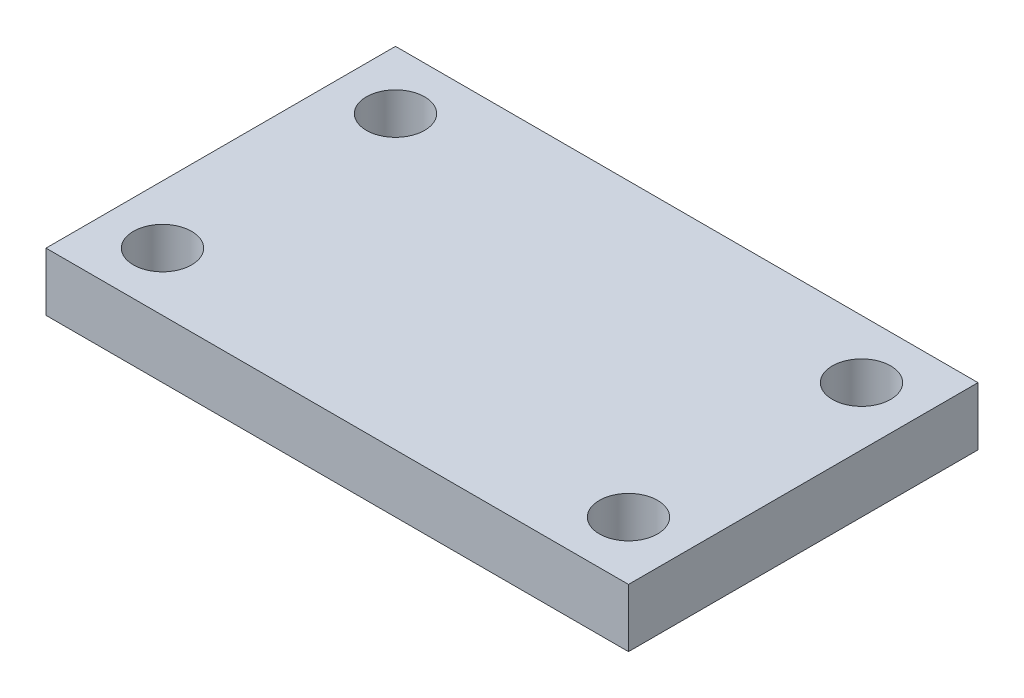
ISO-10303-21;
HEADER;
FILE_DESCRIPTION(('STEP AP214'),'2;1');
FILE_NAME('part.step','',(''),(''),'','','');
FILE_SCHEMA(('AUTOMOTIVE_DESIGN { 1 0 10303 214 1 1 1 1 }'));
ENDSEC;
DATA;
#1=APPLICATION_CONTEXT('core data for automotive mechanical design processes');
#2=APPLICATION_PROTOCOL_DEFINITION('international standard','automotive_design',2000,#1);
#3=PRODUCT_CONTEXT('',#1,'mechanical');
#4=PRODUCT('Part','Part','',(#3));
#5=PRODUCT_RELATED_PRODUCT_CATEGORY('part','',(#4));
#6=PRODUCT_DEFINITION_FORMATION('','',#4);
#7=PRODUCT_DEFINITION_CONTEXT('part definition',#1,'design');
#8=PRODUCT_DEFINITION('design','',#6,#7);
#9=PRODUCT_DEFINITION_SHAPE('','',#8);
#10=(LENGTH_UNIT() NAMED_UNIT(*) SI_UNIT(.MILLI.,.METRE.));
#11=(NAMED_UNIT(*) PLANE_ANGLE_UNIT() SI_UNIT($,.RADIAN.));
#12=(NAMED_UNIT(*) SI_UNIT($,.STERADIAN.) SOLID_ANGLE_UNIT());
#13=UNCERTAINTY_MEASURE_WITH_UNIT(LENGTH_MEASURE(1.E-05),#10,'distance_accuracy_value','');
#14=(GEOMETRIC_REPRESENTATION_CONTEXT(3) GLOBAL_UNCERTAINTY_ASSIGNED_CONTEXT((#13)) GLOBAL_UNIT_ASSIGNED_CONTEXT((#10,
#11,#12)) REPRESENTATION_CONTEXT('',''));
#15=CARTESIAN_POINT('',(0.,0.,0.));
#16=DIRECTION('',(0.,0.,1.));
#17=DIRECTION('',(1.,0.,0.));
#18=AXIS2_PLACEMENT_3D('',#15,#16,#17);
#19=CARTESIAN_POINT('',(0.,25.4,0.));
#20=DIRECTION('',(0.,1.,0.));
#21=DIRECTION('',(0.,0.,1.));
#22=AXIS2_PLACEMENT_3D('',#19,#20,#21);
#23=PLANE('',#22);
#24=CARTESIAN_POINT('',(-101.6,25.4,50.8));
#25=DIRECTION('',(0.,1.,0.));
#26=DIRECTION('',(0.,0.,1.));
#27=AXIS2_PLACEMENT_3D('',#24,#25,#26);
#28=CIRCLE('',#27,12.7);
#29=CARTESIAN_POINT('',(-101.6,25.4,63.5));
#30=VERTEX_POINT('',#29);
#31=EDGE_CURVE('E122',#30,#30,#28,.T.);
#32=ORIENTED_EDGE('',*,*,#31,.F.);
#33=EDGE_LOOP('',(#32));
#34=FACE_BOUND('',#33,.T.);
#35=CARTESIAN_POINT('',(-101.6,25.4,-50.8));
#36=DIRECTION('',(0.,1.,0.));
#37=DIRECTION('',(0.,0.,1.));
#38=AXIS2_PLACEMENT_3D('',#35,#36,#37);
#39=CIRCLE('',#38,12.7);
#40=CARTESIAN_POINT('',(-101.6,25.4,-38.1));
#41=VERTEX_POINT('',#40);
#42=EDGE_CURVE('E101',#41,#41,#39,.T.);
#43=ORIENTED_EDGE('',*,*,#42,.F.);
#44=EDGE_LOOP('',(#43));
#45=FACE_BOUND('',#44,.T.);
#46=DIRECTION('',(0.,0.,1.));
#47=VECTOR('',#46,1.);
#48=CARTESIAN_POINT('',(-127.,25.4,-76.2));
#49=LINE('',#48,#47);
#50=CARTESIAN_POINT('',(-127.,25.4,-76.2));
#51=VERTEX_POINT('',#50);
#52=CARTESIAN_POINT('',(-127.,25.4,76.2));
#53=VERTEX_POINT('',#52);
#54=EDGE_CURVE('E86',#51,#53,#49,.T.);
#55=ORIENTED_EDGE('',*,*,#54,.T.);
#56=DIRECTION('',(1.,0.,0.));
#57=VECTOR('',#56,1.);
#58=CARTESIAN_POINT('',(-127.,25.4,76.2));
#59=LINE('',#58,#57);
#60=CARTESIAN_POINT('',(127.,25.4,76.2));
#61=VERTEX_POINT('',#60);
#62=EDGE_CURVE('E81',#53,#61,#59,.T.);
#63=ORIENTED_EDGE('',*,*,#62,.T.);
#64=DIRECTION('',(0.,0.,-1.));
#65=VECTOR('',#64,1.);
#66=CARTESIAN_POINT('',(127.,25.4,-76.2));
#67=LINE('',#66,#65);
#68=CARTESIAN_POINT('',(127.,25.4,-76.2));
#69=VERTEX_POINT('',#68);
#70=EDGE_CURVE('E84',#61,#69,#67,.T.);
#71=ORIENTED_EDGE('',*,*,#70,.T.);
#72=DIRECTION('',(-1.,0.,0.));
#73=VECTOR('',#72,1.);
#74=CARTESIAN_POINT('',(-127.,25.4,-76.2));
#75=LINE('',#74,#73);
#76=EDGE_CURVE('E51',#69,#51,#75,.T.);
#77=ORIENTED_EDGE('',*,*,#76,.T.);
#78=EDGE_LOOP('',(#55,#63,#71,#77));
#79=FACE_BOUND('',#78,.T.);
#80=CARTESIAN_POINT('',(101.6,25.4,-50.8));
#81=DIRECTION('',(0.,1.,0.));
#82=DIRECTION('',(0.,0.,1.));
#83=AXIS2_PLACEMENT_3D('',#80,#81,#82);
#84=CIRCLE('',#83,12.7);
#85=CARTESIAN_POINT('',(101.6,25.4,-38.1));
#86=VERTEX_POINT('',#85);
#87=EDGE_CURVE('E116',#86,#86,#84,.T.);
#88=ORIENTED_EDGE('',*,*,#87,.F.);
#89=EDGE_LOOP('',(#88));
#90=FACE_BOUND('',#89,.T.);
#91=CARTESIAN_POINT('',(101.6,25.4,50.8));
#92=DIRECTION('',(0.,1.,0.));
#93=DIRECTION('',(0.,0.,1.));
#94=AXIS2_PLACEMENT_3D('',#91,#92,#93);
#95=CIRCLE('',#94,12.7);
#96=CARTESIAN_POINT('',(101.6,25.4,63.5));
#97=VERTEX_POINT('',#96);
#98=EDGE_CURVE('E128',#97,#97,#95,.T.);
#99=ORIENTED_EDGE('',*,*,#98,.F.);
#100=EDGE_LOOP('',(#99));
#101=FACE_BOUND('',#100,.T.);
#102=ADVANCED_FACE('F34',(#34,#45,#79,#90,#101),#23,.T.);
#103=CARTESIAN_POINT('',(0.,0.,0.));
#104=DIRECTION('',(0.,1.,0.));
#105=DIRECTION('',(0.,0.,1.));
#106=AXIS2_PLACEMENT_3D('',#103,#104,#105);
#107=PLANE('',#106);
#108=DIRECTION('',(0.,0.,1.));
#109=VECTOR('',#108,1.);
#110=CARTESIAN_POINT('',(-127.,0.,-76.2));
#111=LINE('',#110,#109);
#112=CARTESIAN_POINT('',(-127.,0.,-76.2));
#113=VERTEX_POINT('',#112);
#114=CARTESIAN_POINT('',(-127.,0.,76.2));
#115=VERTEX_POINT('',#114);
#116=EDGE_CURVE('E98',#113,#115,#111,.T.);
#117=ORIENTED_EDGE('',*,*,#116,.F.);
#118=DIRECTION('',(-1.,0.,0.));
#119=VECTOR('',#118,1.);
#120=CARTESIAN_POINT('',(-127.,0.,-76.2));
#121=LINE('',#120,#119);
#122=CARTESIAN_POINT('',(127.,0.,-76.2));
#123=VERTEX_POINT('',#122);
#124=EDGE_CURVE('E74',#123,#113,#121,.T.);
#125=ORIENTED_EDGE('',*,*,#124,.F.);
#126=DIRECTION('',(0.,0.,-1.));
#127=VECTOR('',#126,1.);
#128=CARTESIAN_POINT('',(127.,0.,-76.2));
#129=LINE('',#128,#127);
#130=CARTESIAN_POINT('',(127.,0.,76.2));
#131=VERTEX_POINT('',#130);
#132=EDGE_CURVE('E68',#131,#123,#129,.T.);
#133=ORIENTED_EDGE('',*,*,#132,.F.);
#134=DIRECTION('',(1.,0.,0.));
#135=VECTOR('',#134,1.);
#136=CARTESIAN_POINT('',(-127.,0.,76.2));
#137=LINE('',#136,#135);
#138=EDGE_CURVE('E90',#115,#131,#137,.T.);
#139=ORIENTED_EDGE('',*,*,#138,.F.);
#140=EDGE_LOOP('',(#117,#125,#133,#139));
#141=FACE_BOUND('',#140,.T.);
#142=CARTESIAN_POINT('',(-101.6,0.,-50.8));
#143=DIRECTION('',(0.,1.,0.));
#144=DIRECTION('',(0.,0.,1.));
#145=AXIS2_PLACEMENT_3D('',#142,#143,#144);
#146=CIRCLE('',#145,12.7);
#147=CARTESIAN_POINT('',(-101.6,0.,-38.1));
#148=VERTEX_POINT('',#147);
#149=EDGE_CURVE('E113',#148,#148,#146,.T.);
#150=ORIENTED_EDGE('',*,*,#149,.T.);
#151=EDGE_LOOP('',(#150));
#152=FACE_BOUND('',#151,.T.);
#153=CARTESIAN_POINT('',(101.6,0.,-50.8));
#154=DIRECTION('',(0.,1.,0.));
#155=DIRECTION('',(0.,0.,1.));
#156=AXIS2_PLACEMENT_3D('',#153,#154,#155);
#157=CIRCLE('',#156,12.7);
#158=CARTESIAN_POINT('',(101.6,0.,-38.1));
#159=VERTEX_POINT('',#158);
#160=EDGE_CURVE('E119',#159,#159,#157,.T.);
#161=ORIENTED_EDGE('',*,*,#160,.T.);
#162=EDGE_LOOP('',(#161));
#163=FACE_BOUND('',#162,.T.);
#164=CARTESIAN_POINT('',(-101.6,0.,50.8));
#165=DIRECTION('',(0.,1.,0.));
#166=DIRECTION('',(0.,0.,1.));
#167=AXIS2_PLACEMENT_3D('',#164,#165,#166);
#168=CIRCLE('',#167,12.7);
#169=CARTESIAN_POINT('',(-101.6,0.,63.5));
#170=VERTEX_POINT('',#169);
#171=EDGE_CURVE('E125',#170,#170,#168,.T.);
#172=ORIENTED_EDGE('',*,*,#171,.T.);
#173=EDGE_LOOP('',(#172));
#174=FACE_BOUND('',#173,.T.);
#175=CARTESIAN_POINT('',(101.6,0.,50.8));
#176=DIRECTION('',(0.,1.,0.));
#177=DIRECTION('',(0.,0.,1.));
#178=AXIS2_PLACEMENT_3D('',#175,#176,#177);
#179=CIRCLE('',#178,12.7);
#180=CARTESIAN_POINT('',(101.6,0.,63.5));
#181=VERTEX_POINT('',#180);
#182=EDGE_CURVE('E131',#181,#181,#179,.T.);
#183=ORIENTED_EDGE('',*,*,#182,.T.);
#184=EDGE_LOOP('',(#183));
#185=FACE_BOUND('',#184,.T.);
#186=ADVANCED_FACE('F109',(#141,#152,#163,#174,#185),#107,.F.);
#187=CARTESIAN_POINT('',(-127.,25.4,-76.2));
#188=DIRECTION('',(1.,0.,0.));
#189=DIRECTION('',(0.,0.,-1.));
#190=AXIS2_PLACEMENT_3D('',#187,#188,#189);
#191=PLANE('',#190);
#192=ORIENTED_EDGE('',*,*,#116,.T.);
#193=DIRECTION('',(0.,-1.,0.));
#194=VECTOR('',#193,1.);
#195=CARTESIAN_POINT('',(-127.,25.4,76.2));
#196=LINE('',#195,#194);
#197=EDGE_CURVE('E11',#53,#115,#196,.T.);
#198=ORIENTED_EDGE('',*,*,#197,.F.);
#199=ORIENTED_EDGE('',*,*,#54,.F.);
#200=DIRECTION('',(0.,-1.,0.));
#201=VECTOR('',#200,1.);
#202=CARTESIAN_POINT('',(-127.,25.4,-76.2));
#203=LINE('',#202,#201);
#204=EDGE_CURVE('E94',#51,#113,#203,.T.);
#205=ORIENTED_EDGE('',*,*,#204,.T.);
#206=EDGE_LOOP('',(#192,#198,#199,#205));
#207=FACE_BOUND('',#206,.T.);
#208=ADVANCED_FACE('F36',(#207),#191,.F.);
#209=CARTESIAN_POINT('',(-127.,25.4,76.2));
#210=DIRECTION('',(0.,0.,-1.));
#211=DIRECTION('',(-1.,0.,0.));
#212=AXIS2_PLACEMENT_3D('',#209,#210,#211);
#213=PLANE('',#212);
#214=ORIENTED_EDGE('',*,*,#138,.T.);
#215=DIRECTION('',(0.,-1.,0.));
#216=VECTOR('',#215,1.);
#217=CARTESIAN_POINT('',(127.,25.4,76.2));
#218=LINE('',#217,#216);
#219=EDGE_CURVE('E43',#61,#131,#218,.T.);
#220=ORIENTED_EDGE('',*,*,#219,.F.);
#221=ORIENTED_EDGE('',*,*,#62,.F.);
#222=ORIENTED_EDGE('',*,*,#197,.T.);
#223=EDGE_LOOP('',(#214,#220,#221,#222));
#224=FACE_BOUND('',#223,.T.);
#225=ADVANCED_FACE('F89',(#224),#213,.F.);
#226=CARTESIAN_POINT('',(127.,25.4,-76.2));
#227=DIRECTION('',(-1.,0.,0.));
#228=DIRECTION('',(0.,0.,1.));
#229=AXIS2_PLACEMENT_3D('',#226,#227,#228);
#230=PLANE('',#229);
#231=ORIENTED_EDGE('',*,*,#132,.T.);
#232=DIRECTION('',(0.,-1.,0.));
#233=VECTOR('',#232,1.);
#234=CARTESIAN_POINT('',(127.,25.4,-76.2));
#235=LINE('',#234,#233);
#236=EDGE_CURVE('E91',#69,#123,#235,.T.);
#237=ORIENTED_EDGE('',*,*,#236,.F.);
#238=ORIENTED_EDGE('',*,*,#70,.F.);
#239=ORIENTED_EDGE('',*,*,#219,.T.);
#240=EDGE_LOOP('',(#231,#237,#238,#239));
#241=FACE_BOUND('',#240,.T.);
#242=ADVANCED_FACE('F92',(#241),#230,.F.);
#243=CARTESIAN_POINT('',(-127.,25.4,-76.2));
#244=DIRECTION('',(0.,0.,1.));
#245=DIRECTION('',(1.,0.,0.));
#246=AXIS2_PLACEMENT_3D('',#243,#244,#245);
#247=PLANE('',#246);
#248=ORIENTED_EDGE('',*,*,#124,.T.);
#249=ORIENTED_EDGE('',*,*,#204,.F.);
#250=ORIENTED_EDGE('',*,*,#76,.F.);
#251=ORIENTED_EDGE('',*,*,#236,.T.);
#252=EDGE_LOOP('',(#248,#249,#250,#251));
#253=FACE_BOUND('',#252,.T.);
#254=ADVANCED_FACE('F106',(#253),#247,.F.);
#255=CARTESIAN_POINT('',(-101.6,25.4,-50.8));
#256=DIRECTION('',(0.,-1.,0.));
#257=DIRECTION('',(0.,0.,-1.));
#258=AXIS2_PLACEMENT_3D('',#255,#256,#257);
#259=CYLINDRICAL_SURFACE('',#258,12.7);
#260=ORIENTED_EDGE('',*,*,#42,.T.);
#261=EDGE_LOOP('',(#260));
#262=FACE_BOUND('',#261,.T.);
#263=ORIENTED_EDGE('',*,*,#149,.F.);
#264=EDGE_LOOP('',(#263));
#265=FACE_BOUND('',#264,.T.);
#266=ADVANCED_FACE('F150',(#262,#265),#259,.F.);
#267=CARTESIAN_POINT('',(101.6,25.4,-50.8));
#268=DIRECTION('',(0.,-1.,0.));
#269=DIRECTION('',(0.,0.,-1.));
#270=AXIS2_PLACEMENT_3D('',#267,#268,#269);
#271=CYLINDRICAL_SURFACE('',#270,12.7);
#272=ORIENTED_EDGE('',*,*,#87,.T.);
#273=EDGE_LOOP('',(#272));
#274=FACE_BOUND('',#273,.T.);
#275=ORIENTED_EDGE('',*,*,#160,.F.);
#276=EDGE_LOOP('',(#275));
#277=FACE_BOUND('',#276,.T.);
#278=ADVANCED_FACE('F196',(#274,#277),#271,.F.);
#279=CARTESIAN_POINT('',(-101.6,25.4,50.8));
#280=DIRECTION('',(0.,-1.,0.));
#281=DIRECTION('',(0.,0.,-1.));
#282=AXIS2_PLACEMENT_3D('',#279,#280,#281);
#283=CYLINDRICAL_SURFACE('',#282,12.7);
#284=ORIENTED_EDGE('',*,*,#31,.T.);
#285=EDGE_LOOP('',(#284));
#286=FACE_BOUND('',#285,.T.);
#287=ORIENTED_EDGE('',*,*,#171,.F.);
#288=EDGE_LOOP('',(#287));
#289=FACE_BOUND('',#288,.T.);
#290=ADVANCED_FACE('F204',(#286,#289),#283,.F.);
#291=CARTESIAN_POINT('',(101.6,25.4,50.8));
#292=DIRECTION('',(0.,-1.,0.));
#293=DIRECTION('',(0.,0.,-1.));
#294=AXIS2_PLACEMENT_3D('',#291,#292,#293);
#295=CYLINDRICAL_SURFACE('',#294,12.7);
#296=ORIENTED_EDGE('',*,*,#98,.T.);
#297=EDGE_LOOP('',(#296));
#298=FACE_BOUND('',#297,.T.);
#299=ORIENTED_EDGE('',*,*,#182,.F.);
#300=EDGE_LOOP('',(#299));
#301=FACE_BOUND('',#300,.T.);
#302=ADVANCED_FACE('F137',(#298,#301),#295,.F.);
#303=CLOSED_SHELL('',(#102,#186,#208,#225,#242,#254,#266,#278,#290,#302));
#304=MANIFOLD_SOLID_BREP('B2',#303);
#305=ADVANCED_BREP_SHAPE_REPRESENTATION('',(#18,#304),#14);
#306=SHAPE_DEFINITION_REPRESENTATION(#9,#305);
ENDSEC;
END-ISO-10303-21;
